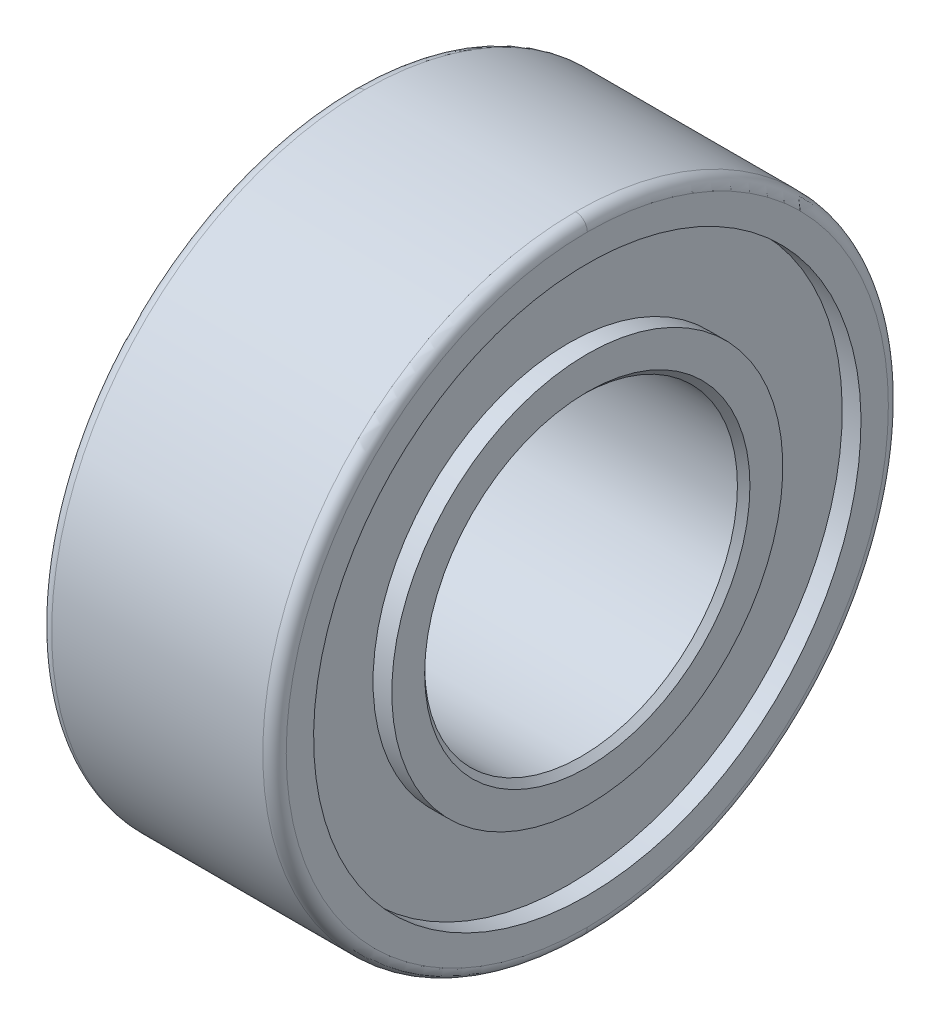
ISO-10303-21;
HEADER;
FILE_DESCRIPTION(('STEP AP214'),'2;1');
FILE_NAME('part.step','',(''),(''),'','','');
FILE_SCHEMA(('AUTOMOTIVE_DESIGN { 1 0 10303 214 1 1 1 1 }'));
ENDSEC;
DATA;
#1=APPLICATION_CONTEXT('core data for automotive mechanical design processes');
#2=APPLICATION_PROTOCOL_DEFINITION('international standard','automotive_design',2000,#1);
#3=PRODUCT_CONTEXT('',#1,'mechanical');
#4=PRODUCT('Part','Part','',(#3));
#5=PRODUCT_RELATED_PRODUCT_CATEGORY('part','',(#4));
#6=PRODUCT_DEFINITION_FORMATION('','',#4);
#7=PRODUCT_DEFINITION_CONTEXT('part definition',#1,'design');
#8=PRODUCT_DEFINITION('design','',#6,#7);
#9=PRODUCT_DEFINITION_SHAPE('','',#8);
#10=(LENGTH_UNIT() NAMED_UNIT(*) SI_UNIT(.MILLI.,.METRE.));
#11=(NAMED_UNIT(*) PLANE_ANGLE_UNIT() SI_UNIT($,.RADIAN.));
#12=(NAMED_UNIT(*) SI_UNIT($,.STERADIAN.) SOLID_ANGLE_UNIT());
#13=UNCERTAINTY_MEASURE_WITH_UNIT(LENGTH_MEASURE(1.E-05),#10,'distance_accuracy_value','');
#14=(GEOMETRIC_REPRESENTATION_CONTEXT(3) GLOBAL_UNCERTAINTY_ASSIGNED_CONTEXT((#13)) GLOBAL_UNIT_ASSIGNED_CONTEXT((#10,
#11,#12)) REPRESENTATION_CONTEXT('',''));
#15=CARTESIAN_POINT('',(0.,0.,0.));
#16=DIRECTION('',(0.,0.,1.));
#17=DIRECTION('',(1.,0.,0.));
#18=AXIS2_PLACEMENT_3D('',#15,#16,#17);
#19=CARTESIAN_POINT('',(2.38125,0.,5.55625));
#20=DIRECTION('',(-1.,0.,0.));
#21=DIRECTION('',(0.,-1.,0.));
#22=AXIS2_PLACEMENT_3D('',#19,#20,#21);
#23=PLANE('',#22);
#24=CARTESIAN_POINT('',(2.38125,0.,0.));
#25=DIRECTION('',(1.,0.,0.));
#26=DIRECTION('',(0.,-1.,0.));
#27=AXIS2_PLACEMENT_3D('',#24,#25,#26);
#28=CIRCLE('',#27,3.30199999997749);
#29=CARTESIAN_POINT('',(2.38125,-3.30199999997749,0.));
#30=VERTEX_POINT('',#29);
#31=EDGE_CURVE('E141',#30,#30,#28,.T.);
#32=ORIENTED_EDGE('',*,*,#31,.F.);
#33=EDGE_LOOP('',(#32));
#34=FACE_BOUND('',#33,.T.);
#35=CARTESIAN_POINT('',(2.38125,0.,0.));
#36=DIRECTION('',(-1.,0.,0.));
#37=DIRECTION('',(0.,-1.,0.));
#38=AXIS2_PLACEMENT_3D('',#35,#36,#37);
#39=CIRCLE('',#38,3.96875);
#40=CARTESIAN_POINT('',(2.38125,-3.96875,0.));
#41=VERTEX_POINT('',#40);
#42=EDGE_CURVE('E136',#41,#41,#39,.T.);
#43=ORIENTED_EDGE('',*,*,#42,.F.);
#44=EDGE_LOOP('',(#43));
#45=FACE_BOUND('',#44,.T.);
#46=ADVANCED_FACE('F18',(#34,#45),#23,.F.);
#47=CARTESIAN_POINT('',(-2.38125,0.,6.35));
#48=DIRECTION('',(1.,0.,0.));
#49=DIRECTION('',(0.,1.,0.));
#50=AXIS2_PLACEMENT_3D('',#47,#48,#49);
#51=PLANE('',#50);
#52=CARTESIAN_POINT('',(-2.38125,0.,0.));
#53=DIRECTION('',(-1.,0.,0.));
#54=DIRECTION('',(0.,1.,0.));
#55=AXIS2_PLACEMENT_3D('',#52,#53,#54);
#56=CIRCLE('',#55,3.30199999997748);
#57=CARTESIAN_POINT('',(-2.38125,3.30199999997748,0.));
#58=VERTEX_POINT('',#57);
#59=EDGE_CURVE('E142',#58,#58,#56,.T.);
#60=ORIENTED_EDGE('',*,*,#59,.F.);
#61=EDGE_LOOP('',(#60));
#62=FACE_BOUND('',#61,.T.);
#63=CARTESIAN_POINT('',(-2.38125,0.,0.));
#64=DIRECTION('',(1.,0.,0.));
#65=DIRECTION('',(0.,1.,0.));
#66=AXIS2_PLACEMENT_3D('',#63,#64,#65);
#67=CIRCLE('',#66,3.96875);
#68=CARTESIAN_POINT('',(-2.38125,3.96875,0.));
#69=VERTEX_POINT('',#68);
#70=EDGE_CURVE('E132',#69,#69,#67,.T.);
#71=ORIENTED_EDGE('',*,*,#70,.F.);
#72=EDGE_LOOP('',(#71));
#73=FACE_BOUND('',#72,.T.);
#74=ADVANCED_FACE('F196',(#62,#73),#51,.F.);
#75=CARTESIAN_POINT('',(2.00025,0.,3.96875));
#76=DIRECTION('',(-1.,0.,0.));
#77=DIRECTION('',(0.,-1.,0.));
#78=AXIS2_PLACEMENT_3D('',#75,#76,#77);
#79=PLANE('',#78);
#80=CARTESIAN_POINT('',(2.00025,0.,0.));
#81=DIRECTION('',(1.,0.,0.));
#82=DIRECTION('',(0.,-1.,0.));
#83=AXIS2_PLACEMENT_3D('',#80,#81,#82);
#84=CIRCLE('',#83,5.55625);
#85=CARTESIAN_POINT('',(2.00025,-5.55625,0.));
#86=VERTEX_POINT('',#85);
#87=EDGE_CURVE('E122',#86,#86,#84,.T.);
#88=ORIENTED_EDGE('',*,*,#87,.T.);
#89=EDGE_LOOP('',(#88));
#90=FACE_BOUND('',#89,.T.);
#91=CARTESIAN_POINT('',(2.00025,0.,0.));
#92=DIRECTION('',(1.,0.,0.));
#93=DIRECTION('',(0.,-1.,0.));
#94=AXIS2_PLACEMENT_3D('',#91,#92,#93);
#95=CIRCLE('',#94,3.96875);
#96=CARTESIAN_POINT('',(2.00025,-3.96875,0.));
#97=VERTEX_POINT('',#96);
#98=EDGE_CURVE('E133',#97,#97,#95,.T.);
#99=ORIENTED_EDGE('',*,*,#98,.F.);
#100=EDGE_LOOP('',(#99));
#101=FACE_BOUND('',#100,.T.);
#102=ADVANCED_FACE('F202',(#90,#101),#79,.F.);
#103=CARTESIAN_POINT('',(-2.00025,0.,5.55625));
#104=DIRECTION('',(1.,0.,0.));
#105=DIRECTION('',(0.,1.,0.));
#106=AXIS2_PLACEMENT_3D('',#103,#104,#105);
#107=PLANE('',#106);
#108=CARTESIAN_POINT('',(-2.00025,0.,0.));
#109=DIRECTION('',(-1.,0.,0.));
#110=DIRECTION('',(0.,-1.,0.));
#111=AXIS2_PLACEMENT_3D('',#108,#109,#110);
#112=CIRCLE('',#111,3.96875);
#113=CARTESIAN_POINT('',(-2.00025,-3.96875,0.));
#114=VERTEX_POINT('',#113);
#115=EDGE_CURVE('E128',#114,#114,#112,.T.);
#116=ORIENTED_EDGE('',*,*,#115,.F.);
#117=EDGE_LOOP('',(#116));
#118=FACE_BOUND('',#117,.T.);
#119=CARTESIAN_POINT('',(-2.00025,0.,0.));
#120=DIRECTION('',(-1.,0.,0.));
#121=DIRECTION('',(0.,-1.,0.));
#122=AXIS2_PLACEMENT_3D('',#119,#120,#121);
#123=CIRCLE('',#122,5.55625);
#124=CARTESIAN_POINT('',(-2.00025,-5.55625,0.));
#125=VERTEX_POINT('',#124);
#126=EDGE_CURVE('E118',#125,#125,#123,.T.);
#127=ORIENTED_EDGE('',*,*,#126,.T.);
#128=EDGE_LOOP('',(#127));
#129=FACE_BOUND('',#128,.T.);
#130=ADVANCED_FACE('F210',(#118,#129),#107,.F.);
#131=CARTESIAN_POINT('',(2.38125,0.,0.));
#132=DIRECTION('',(-1.,0.,0.));
#133=DIRECTION('',(0.,-1.,0.));
#134=AXIS2_PLACEMENT_3D('',#131,#132,#133);
#135=CIRCLE('',#134,6.111875);
#136=CARTESIAN_POINT('',(2.38125,-6.111875,0.));
#137=VERTEX_POINT('',#136);
#138=CARTESIAN_POINT('',(2.38125,6.111875,0.));
#139=VERTEX_POINT('',#138);
#140=EDGE_CURVE('E11',#137,#139,#135,.T.);
#141=ORIENTED_EDGE('',*,*,#140,.F.);
#142=CARTESIAN_POINT('',(2.38125,0.,0.));
#143=DIRECTION('',(-1.,0.,0.));
#144=DIRECTION('',(0.,1.,0.));
#145=AXIS2_PLACEMENT_3D('',#142,#143,#144);
#146=CIRCLE('',#145,6.111875);
#147=EDGE_CURVE('E84',#139,#137,#146,.T.);
#148=ORIENTED_EDGE('',*,*,#147,.F.);
#149=EDGE_LOOP('',(#141,#148));
#150=FACE_BOUND('',#149,.T.);
#151=CARTESIAN_POINT('',(2.38125,0.,0.));
#152=DIRECTION('',(1.,0.,0.));
#153=DIRECTION('',(0.,-1.,0.));
#154=AXIS2_PLACEMENT_3D('',#151,#152,#153);
#155=CIRCLE('',#154,5.55625);
#156=CARTESIAN_POINT('',(2.38125,-5.55625,0.));
#157=VERTEX_POINT('',#156);
#158=EDGE_CURVE('E117',#157,#157,#155,.T.);
#159=ORIENTED_EDGE('',*,*,#158,.F.);
#160=EDGE_LOOP('',(#159));
#161=FACE_BOUND('',#160,.T.);
#162=ADVANCED_FACE('F199',(#150,#161),#23,.F.);
#163=CARTESIAN_POINT('',(-2.38125,0.,0.));
#164=DIRECTION('',(1.,0.,0.));
#165=DIRECTION('',(0.,1.,0.));
#166=AXIS2_PLACEMENT_3D('',#163,#164,#165);
#167=CIRCLE('',#166,6.111875);
#168=CARTESIAN_POINT('',(-2.38125,6.111875,0.));
#169=VERTEX_POINT('',#168);
#170=CARTESIAN_POINT('',(-2.38125,-6.111875,0.));
#171=VERTEX_POINT('',#170);
#172=EDGE_CURVE('E28',#169,#171,#167,.T.);
#173=ORIENTED_EDGE('',*,*,#172,.F.);
#174=CARTESIAN_POINT('',(-2.38125,0.,0.));
#175=DIRECTION('',(1.,0.,0.));
#176=DIRECTION('',(0.,-1.,0.));
#177=AXIS2_PLACEMENT_3D('',#174,#175,#176);
#178=CIRCLE('',#177,6.111875);
#179=EDGE_CURVE('E96',#171,#169,#178,.T.);
#180=ORIENTED_EDGE('',*,*,#179,.F.);
#181=EDGE_LOOP('',(#173,#180));
#182=FACE_BOUND('',#181,.T.);
#183=CARTESIAN_POINT('',(-2.38125,0.,0.));
#184=DIRECTION('',(-1.,0.,0.));
#185=DIRECTION('',(0.,-1.,0.));
#186=AXIS2_PLACEMENT_3D('',#183,#184,#185);
#187=CIRCLE('',#186,5.55625);
#188=CARTESIAN_POINT('',(-2.38125,-5.55625,0.));
#189=VERTEX_POINT('',#188);
#190=EDGE_CURVE('E113',#189,#189,#187,.T.);
#191=ORIENTED_EDGE('',*,*,#190,.F.);
#192=EDGE_LOOP('',(#191));
#193=FACE_BOUND('',#192,.T.);
#194=ADVANCED_FACE('F205',(#182,#193),#51,.F.);
#195=CARTESIAN_POINT('',(2.143125,0.,0.));
#196=DIRECTION('',(-1.,0.,0.));
#197=DIRECTION('',(0.,0.,-1.));
#198=AXIS2_PLACEMENT_3D('',#195,#196,#197);
#199=TOROIDAL_SURFACE('',#198,6.111875,0.238124999999996);
#200=CARTESIAN_POINT('',(2.143125,6.111875,0.));
#201=DIRECTION('',(0.,0.,-1.));
#202=DIRECTION('',(0.,1.,0.));
#203=AXIS2_PLACEMENT_3D('',#200,#201,#202);
#204=CIRCLE('',#203,0.238125);
#205=CARTESIAN_POINT('',(2.143125,6.35,0.));
#206=VERTEX_POINT('',#205);
#207=EDGE_CURVE('E79',#206,#139,#204,.T.);
#208=ORIENTED_EDGE('',*,*,#207,.F.);
#209=CARTESIAN_POINT('',(2.143125,0.,0.));
#210=DIRECTION('',(-1.,0.,0.));
#211=DIRECTION('',(0.,-1.,0.));
#212=AXIS2_PLACEMENT_3D('',#209,#210,#211);
#213=CIRCLE('',#212,6.35);
#214=CARTESIAN_POINT('',(2.143125,-6.35,0.));
#215=VERTEX_POINT('',#214);
#216=EDGE_CURVE('E69',#215,#206,#213,.T.);
#217=ORIENTED_EDGE('',*,*,#216,.F.);
#218=CARTESIAN_POINT('',(2.143125,-6.111875,0.));
#219=DIRECTION('',(0.,0.,1.));
#220=DIRECTION('',(0.,-1.,0.));
#221=AXIS2_PLACEMENT_3D('',#218,#219,#220);
#222=CIRCLE('',#221,0.238125);
#223=EDGE_CURVE('E76',#215,#137,#222,.T.);
#224=ORIENTED_EDGE('',*,*,#223,.T.);
#225=ORIENTED_EDGE('',*,*,#140,.T.);
#226=EDGE_LOOP('',(#208,#217,#224,#225));
#227=FACE_BOUND('',#226,.T.);
#228=ADVANCED_FACE('F80',(#227),#199,.T.);
#229=CARTESIAN_POINT('',(-2.143125,0.,0.));
#230=DIRECTION('',(1.,0.,0.));
#231=DIRECTION('',(0.,0.,1.));
#232=AXIS2_PLACEMENT_3D('',#229,#230,#231);
#233=TOROIDAL_SURFACE('',#232,6.111875,0.238125);
#234=CARTESIAN_POINT('',(-2.143125,-6.111875,0.));
#235=DIRECTION('',(0.,0.,-1.));
#236=DIRECTION('',(0.,-1.,0.));
#237=AXIS2_PLACEMENT_3D('',#234,#235,#236);
#238=CIRCLE('',#237,0.238125);
#239=CARTESIAN_POINT('',(-2.143125,-6.35,0.));
#240=VERTEX_POINT('',#239);
#241=EDGE_CURVE('E166',#240,#171,#238,.T.);
#242=ORIENTED_EDGE('',*,*,#241,.F.);
#243=CARTESIAN_POINT('',(-2.143125,0.,0.));
#244=DIRECTION('',(1.,0.,0.));
#245=DIRECTION('',(0.,-1.,0.));
#246=AXIS2_PLACEMENT_3D('',#243,#244,#245);
#247=CIRCLE('',#246,6.35);
#248=CARTESIAN_POINT('',(-2.143125,6.35,0.));
#249=VERTEX_POINT('',#248);
#250=EDGE_CURVE('E75',#249,#240,#247,.T.);
#251=ORIENTED_EDGE('',*,*,#250,.F.);
#252=CARTESIAN_POINT('',(-2.143125,6.111875,0.));
#253=DIRECTION('',(0.,0.,1.));
#254=DIRECTION('',(0.,1.,0.));
#255=AXIS2_PLACEMENT_3D('',#252,#253,#254);
#256=CIRCLE('',#255,0.238125);
#257=EDGE_CURVE('E88',#249,#169,#256,.T.);
#258=ORIENTED_EDGE('',*,*,#257,.T.);
#259=ORIENTED_EDGE('',*,*,#172,.T.);
#260=EDGE_LOOP('',(#242,#251,#258,#259));
#261=FACE_BOUND('',#260,.T.);
#262=ADVANCED_FACE('F190',(#261),#233,.T.);
#263=CARTESIAN_POINT('',(0.,0.,0.));
#264=DIRECTION('',(-1.,0.,0.));
#265=DIRECTION('',(0.,-1.,0.));
#266=AXIS2_PLACEMENT_3D('',#263,#264,#265);
#267=CYLINDRICAL_SURFACE('',#266,3.175);
#268=CARTESIAN_POINT('',(-2.25424999996448,0.,0.));
#269=DIRECTION('',(-1.,0.,0.));
#270=DIRECTION('',(0.,-1.,0.));
#271=AXIS2_PLACEMENT_3D('',#268,#269,#270);
#272=CIRCLE('',#271,3.17499999999882);
#273=CARTESIAN_POINT('',(-2.25424999996448,-3.17499999999882,0.));
#274=VERTEX_POINT('',#273);
#275=EDGE_CURVE('E101',#274,#274,#272,.T.);
#276=ORIENTED_EDGE('',*,*,#275,.T.);
#277=EDGE_LOOP('',(#276));
#278=FACE_BOUND('',#277,.T.);
#279=CARTESIAN_POINT('',(2.25425000002133,0.,0.));
#280=DIRECTION('',(1.,0.,0.));
#281=DIRECTION('',(0.,1.,0.));
#282=AXIS2_PLACEMENT_3D('',#279,#280,#281);
#283=CIRCLE('',#282,3.17500000005566);
#284=CARTESIAN_POINT('',(2.25425000002133,3.17500000005566,0.));
#285=VERTEX_POINT('',#284);
#286=EDGE_CURVE('E137',#285,#285,#283,.T.);
#287=ORIENTED_EDGE('',*,*,#286,.T.);
#288=EDGE_LOOP('',(#287));
#289=FACE_BOUND('',#288,.T.);
#290=ADVANCED_FACE('F246',(#278,#289),#267,.F.);
#291=CARTESIAN_POINT('',(2.38125000004174,0.,0.));
#292=DIRECTION('',(1.,0.,0.));
#293=DIRECTION('',(0.,1.,0.));
#294=AXIS2_PLACEMENT_3D('',#291,#292,#293);
#295=CONICAL_SURFACE('',#294,3.30200000001923,0.785398163173655);
#296=ORIENTED_EDGE('',*,*,#31,.T.);
#297=EDGE_LOOP('',(#296));
#298=FACE_BOUND('',#297,.T.);
#299=ORIENTED_EDGE('',*,*,#286,.F.);
#300=EDGE_LOOP('',(#299));
#301=FACE_BOUND('',#300,.T.);
#302=ADVANCED_FACE('F243',(#298,#301),#295,.F.);
#303=CARTESIAN_POINT('',(-2.38124999992806,0.,0.));
#304=DIRECTION('',(-1.,0.,0.));
#305=DIRECTION('',(0.,-1.,0.));
#306=AXIS2_PLACEMENT_3D('',#303,#304,#305);
#307=CONICAL_SURFACE('',#306,3.30199999990554,0.785398163397448);
#308=ORIENTED_EDGE('',*,*,#59,.T.);
#309=EDGE_LOOP('',(#308));
#310=FACE_BOUND('',#309,.T.);
#311=ORIENTED_EDGE('',*,*,#275,.F.);
#312=EDGE_LOOP('',(#311));
#313=FACE_BOUND('',#312,.T.);
#314=ADVANCED_FACE('F240',(#310,#313),#307,.F.);
#315=CARTESIAN_POINT('',(0.,0.,0.));
#316=DIRECTION('',(-1.,0.,0.));
#317=DIRECTION('',(0.,-1.,0.));
#318=AXIS2_PLACEMENT_3D('',#315,#316,#317);
#319=CYLINDRICAL_SURFACE('',#318,3.96875);
#320=ORIENTED_EDGE('',*,*,#98,.T.);
#321=EDGE_LOOP('',(#320));
#322=FACE_BOUND('',#321,.T.);
#323=ORIENTED_EDGE('',*,*,#42,.T.);
#324=EDGE_LOOP('',(#323));
#325=FACE_BOUND('',#324,.T.);
#326=ADVANCED_FACE('F231',(#322,#325),#319,.T.);
#327=ORIENTED_EDGE('',*,*,#70,.T.);
#328=EDGE_LOOP('',(#327));
#329=FACE_BOUND('',#328,.T.);
#330=ORIENTED_EDGE('',*,*,#115,.T.);
#331=EDGE_LOOP('',(#330));
#332=FACE_BOUND('',#331,.T.);
#333=ADVANCED_FACE('F224',(#329,#332),#319,.T.);
#334=CARTESIAN_POINT('',(0.,0.,0.));
#335=DIRECTION('',(-1.,0.,0.));
#336=DIRECTION('',(0.,-1.,0.));
#337=AXIS2_PLACEMENT_3D('',#334,#335,#336);
#338=CYLINDRICAL_SURFACE('',#337,5.55625);
#339=ORIENTED_EDGE('',*,*,#87,.F.);
#340=EDGE_LOOP('',(#339));
#341=FACE_BOUND('',#340,.T.);
#342=ORIENTED_EDGE('',*,*,#158,.T.);
#343=EDGE_LOOP('',(#342));
#344=FACE_BOUND('',#343,.T.);
#345=ADVANCED_FACE('F221',(#341,#344),#338,.F.);
#346=ORIENTED_EDGE('',*,*,#190,.T.);
#347=EDGE_LOOP('',(#346));
#348=FACE_BOUND('',#347,.T.);
#349=ORIENTED_EDGE('',*,*,#126,.F.);
#350=EDGE_LOOP('',(#349));
#351=FACE_BOUND('',#350,.T.);
#352=ADVANCED_FACE('F223',(#348,#351),#338,.F.);
#353=CARTESIAN_POINT('',(0.,0.,0.));
#354=DIRECTION('',(-1.,0.,0.));
#355=DIRECTION('',(0.,-1.,0.));
#356=AXIS2_PLACEMENT_3D('',#353,#354,#355);
#357=CYLINDRICAL_SURFACE('',#356,6.35);
#358=ORIENTED_EDGE('',*,*,#250,.T.);
#359=EDGE_CURVE('E102',#240,#249,#247,.T.);
#360=ORIENTED_EDGE('',*,*,#359,.T.);
#361=EDGE_LOOP('',(#358,#360));
#362=FACE_BOUND('',#361,.T.);
#363=ORIENTED_EDGE('',*,*,#216,.T.);
#364=EDGE_CURVE('E72',#206,#215,#213,.T.);
#365=ORIENTED_EDGE('',*,*,#364,.T.);
#366=EDGE_LOOP('',(#363,#365));
#367=FACE_BOUND('',#366,.T.);
#368=ADVANCED_FACE('F70',(#362,#367),#357,.T.);
#369=CARTESIAN_POINT('',(2.143125,0.,0.));
#370=DIRECTION('',(-1.,0.,0.));
#371=DIRECTION('',(0.,0.,-1.));
#372=AXIS2_PLACEMENT_3D('',#369,#370,#371);
#373=TOROIDAL_SURFACE('',#372,6.111875,0.238124999999996);
#374=ORIENTED_EDGE('',*,*,#364,.F.);
#375=ORIENTED_EDGE('',*,*,#207,.T.);
#376=ORIENTED_EDGE('',*,*,#147,.T.);
#377=ORIENTED_EDGE('',*,*,#223,.F.);
#378=EDGE_LOOP('',(#374,#375,#376,#377));
#379=FACE_BOUND('',#378,.T.);
#380=ADVANCED_FACE('F86',(#379),#373,.T.);
#381=CARTESIAN_POINT('',(-2.143125,0.,0.));
#382=DIRECTION('',(1.,0.,0.));
#383=DIRECTION('',(0.,0.,1.));
#384=AXIS2_PLACEMENT_3D('',#381,#382,#383);
#385=TOROIDAL_SURFACE('',#384,6.111875,0.238125);
#386=ORIENTED_EDGE('',*,*,#359,.F.);
#387=ORIENTED_EDGE('',*,*,#241,.T.);
#388=ORIENTED_EDGE('',*,*,#179,.T.);
#389=ORIENTED_EDGE('',*,*,#257,.F.);
#390=EDGE_LOOP('',(#386,#387,#388,#389));
#391=FACE_BOUND('',#390,.T.);
#392=ADVANCED_FACE('F20',(#391),#385,.T.);
#393=CLOSED_SHELL('',(#46,#74,#102,#130,#162,#194,#228,#262,#290,#302,#314,#326,#333,#345,#352,
#368,#380,#392));
#394=MANIFOLD_SOLID_BREP('B1',#393);
#395=ADVANCED_BREP_SHAPE_REPRESENTATION('',(#18,#394),#14);
#396=SHAPE_DEFINITION_REPRESENTATION(#9,#395);
ENDSEC;
END-ISO-10303-21;
